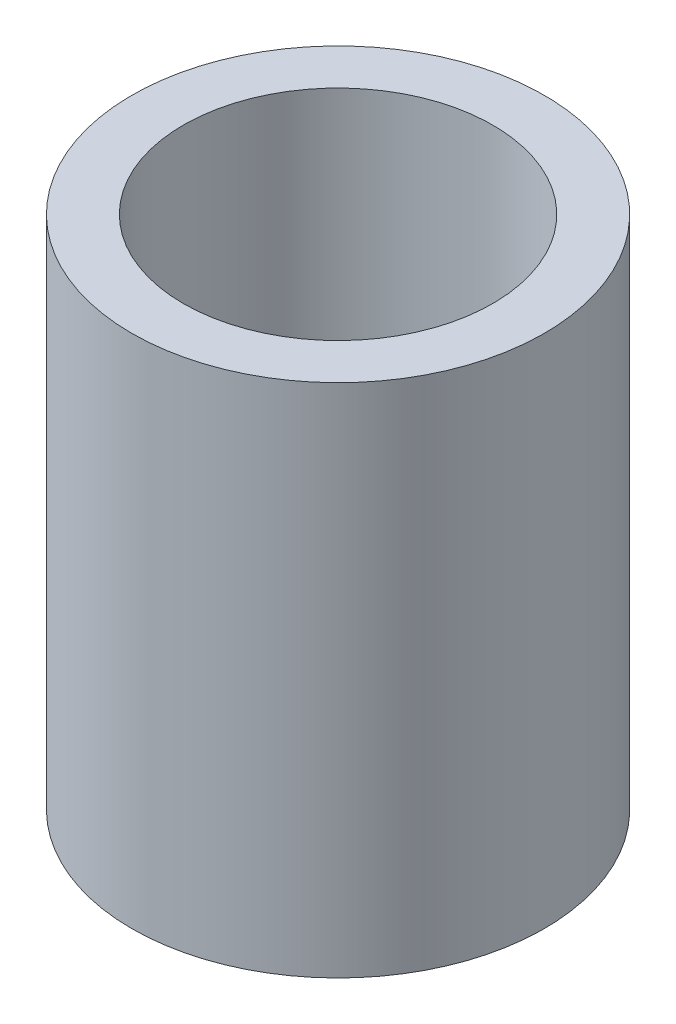
ISO-10303-21;
HEADER;
FILE_DESCRIPTION(('STEP AP214'),'2;1');
FILE_NAME('part.step','',(''),(''),'','','');
FILE_SCHEMA(('AUTOMOTIVE_DESIGN { 1 0 10303 214 1 1 1 1 }'));
ENDSEC;
DATA;
#1=APPLICATION_CONTEXT('core data for automotive mechanical design processes');
#2=APPLICATION_PROTOCOL_DEFINITION('international standard','automotive_design',2000,#1);
#3=PRODUCT_CONTEXT('',#1,'mechanical');
#4=PRODUCT('Part','Part','',(#3));
#5=PRODUCT_RELATED_PRODUCT_CATEGORY('part','',(#4));
#6=PRODUCT_DEFINITION_FORMATION('','',#4);
#7=PRODUCT_DEFINITION_CONTEXT('part definition',#1,'design');
#8=PRODUCT_DEFINITION('design','',#6,#7);
#9=PRODUCT_DEFINITION_SHAPE('','',#8);
#10=(LENGTH_UNIT() NAMED_UNIT(*) SI_UNIT(.MILLI.,.METRE.));
#11=(NAMED_UNIT(*) PLANE_ANGLE_UNIT() SI_UNIT($,.RADIAN.));
#12=(NAMED_UNIT(*) SI_UNIT($,.STERADIAN.) SOLID_ANGLE_UNIT());
#13=UNCERTAINTY_MEASURE_WITH_UNIT(LENGTH_MEASURE(1.E-05),#10,'distance_accuracy_value','');
#14=(GEOMETRIC_REPRESENTATION_CONTEXT(3) GLOBAL_UNCERTAINTY_ASSIGNED_CONTEXT((#13)) GLOBAL_UNIT_ASSIGNED_CONTEXT((#10,
#11,#12)) REPRESENTATION_CONTEXT('',''));
#15=CARTESIAN_POINT('',(0.,0.,0.));
#16=DIRECTION('',(0.,0.,1.));
#17=DIRECTION('',(1.,0.,0.));
#18=AXIS2_PLACEMENT_3D('',#15,#16,#17);
#19=CARTESIAN_POINT('',(0.,50.8,0.));
#20=DIRECTION('',(0.,1.,0.));
#21=DIRECTION('',(0.,0.,1.));
#22=AXIS2_PLACEMENT_3D('',#19,#20,#21);
#23=PLANE('',#22);
#24=CARTESIAN_POINT('',(0.,50.8,0.));
#25=DIRECTION('',(0.,1.,0.));
#26=DIRECTION('',(0.,0.,1.));
#27=AXIS2_PLACEMENT_3D('',#24,#25,#26);
#28=CIRCLE('',#27,20.32);
#29=CARTESIAN_POINT('',(0.,50.8,20.32));
#30=VERTEX_POINT('',#29);
#31=EDGE_CURVE('E10',#30,#30,#28,.T.);
#32=ORIENTED_EDGE('',*,*,#31,.T.);
#33=EDGE_LOOP('',(#32));
#34=FACE_BOUND('',#33,.T.);
#35=CARTESIAN_POINT('',(0.,50.8,0.));
#36=DIRECTION('',(0.,1.,0.));
#37=DIRECTION('',(0.,0.,1.));
#38=AXIS2_PLACEMENT_3D('',#35,#36,#37);
#39=CIRCLE('',#38,15.24);
#40=CARTESIAN_POINT('',(0.,50.8,15.24));
#41=VERTEX_POINT('',#40);
#42=EDGE_CURVE('E56',#41,#41,#39,.T.);
#43=ORIENTED_EDGE('',*,*,#42,.F.);
#44=EDGE_LOOP('',(#43));
#45=FACE_BOUND('',#44,.T.);
#46=ADVANCED_FACE('F43',(#34,#45),#23,.T.);
#47=CARTESIAN_POINT('',(0.,0.,0.));
#48=DIRECTION('',(0.,1.,0.));
#49=DIRECTION('',(0.,0.,1.));
#50=AXIS2_PLACEMENT_3D('',#47,#48,#49);
#51=PLANE('',#50);
#52=CARTESIAN_POINT('',(0.,0.,0.));
#53=DIRECTION('',(0.,1.,0.));
#54=DIRECTION('',(0.,0.,1.));
#55=AXIS2_PLACEMENT_3D('',#52,#53,#54);
#56=CIRCLE('',#55,20.32);
#57=CARTESIAN_POINT('',(0.,0.,20.32));
#58=VERTEX_POINT('',#57);
#59=EDGE_CURVE('E47',#58,#58,#56,.T.);
#60=ORIENTED_EDGE('',*,*,#59,.F.);
#61=EDGE_LOOP('',(#60));
#62=FACE_BOUND('',#61,.T.);
#63=CARTESIAN_POINT('',(0.,0.,0.));
#64=DIRECTION('',(0.,1.,0.));
#65=DIRECTION('',(0.,0.,1.));
#66=AXIS2_PLACEMENT_3D('',#63,#64,#65);
#67=CIRCLE('',#66,15.24);
#68=CARTESIAN_POINT('',(0.,0.,15.24));
#69=VERTEX_POINT('',#68);
#70=EDGE_CURVE('E58',#69,#69,#67,.T.);
#71=ORIENTED_EDGE('',*,*,#70,.T.);
#72=EDGE_LOOP('',(#71));
#73=FACE_BOUND('',#72,.T.);
#74=ADVANCED_FACE('F70',(#62,#73),#51,.F.);
#75=CARTESIAN_POINT('',(0.,50.8,0.));
#76=DIRECTION('',(0.,-1.,0.));
#77=DIRECTION('',(0.,0.,-1.));
#78=AXIS2_PLACEMENT_3D('',#75,#76,#77);
#79=CYLINDRICAL_SURFACE('',#78,20.32);
#80=ORIENTED_EDGE('',*,*,#31,.F.);
#81=EDGE_LOOP('',(#80));
#82=FACE_BOUND('',#81,.T.);
#83=ORIENTED_EDGE('',*,*,#59,.T.);
#84=EDGE_LOOP('',(#83));
#85=FACE_BOUND('',#84,.T.);
#86=ADVANCED_FACE('F45',(#82,#85),#79,.T.);
#87=CARTESIAN_POINT('',(0.,50.8,0.));
#88=DIRECTION('',(0.,-1.,0.));
#89=DIRECTION('',(0.,0.,-1.));
#90=AXIS2_PLACEMENT_3D('',#87,#88,#89);
#91=CYLINDRICAL_SURFACE('',#90,15.24);
#92=ORIENTED_EDGE('',*,*,#42,.T.);
#93=EDGE_LOOP('',(#92));
#94=FACE_BOUND('',#93,.T.);
#95=ORIENTED_EDGE('',*,*,#70,.F.);
#96=EDGE_LOOP('',(#95));
#97=FACE_BOUND('',#96,.T.);
#98=ADVANCED_FACE('F66',(#94,#97),#91,.F.);
#99=CLOSED_SHELL('',(#46,#74,#86,#98));
#100=MANIFOLD_SOLID_BREP('B2',#99);
#101=ADVANCED_BREP_SHAPE_REPRESENTATION('',(#18,#100),#14);
#102=SHAPE_DEFINITION_REPRESENTATION(#9,#101);
ENDSEC;
END-ISO-10303-21;
